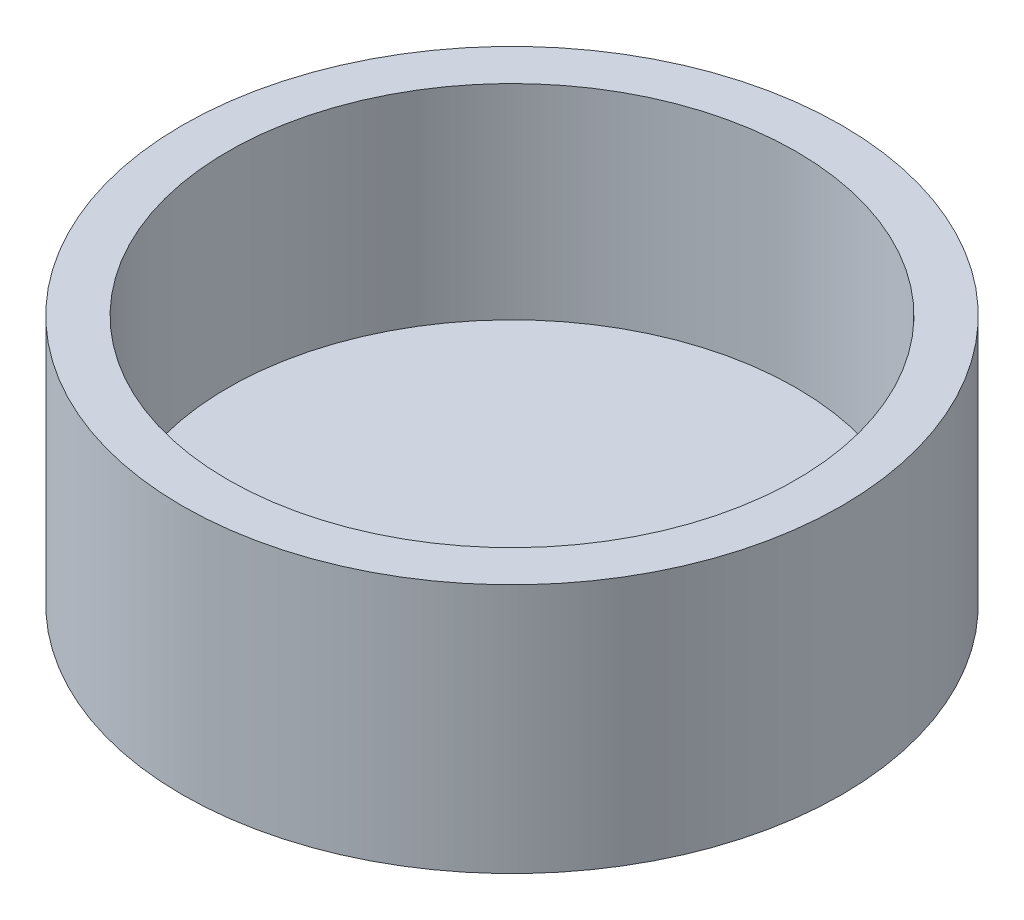
ISO-10303-21;
HEADER;
FILE_DESCRIPTION(('STEP AP214'),'2;1');
FILE_NAME('part.step','',(''),(''),'','','');
FILE_SCHEMA(('AUTOMOTIVE_DESIGN { 1 0 10303 214 1 1 1 1 }'));
ENDSEC;
DATA;
#1=APPLICATION_CONTEXT('core data for automotive mechanical design processes');
#2=APPLICATION_PROTOCOL_DEFINITION('international standard','automotive_design',2000,#1);
#3=PRODUCT_CONTEXT('',#1,'mechanical');
#4=PRODUCT('Part','Part','',(#3));
#5=PRODUCT_RELATED_PRODUCT_CATEGORY('part','',(#4));
#6=PRODUCT_DEFINITION_FORMATION('','',#4);
#7=PRODUCT_DEFINITION_CONTEXT('part definition',#1,'design');
#8=PRODUCT_DEFINITION('design','',#6,#7);
#9=PRODUCT_DEFINITION_SHAPE('','',#8);
#10=(LENGTH_UNIT() NAMED_UNIT(*) SI_UNIT(.MILLI.,.METRE.));
#11=(NAMED_UNIT(*) PLANE_ANGLE_UNIT() SI_UNIT($,.RADIAN.));
#12=(NAMED_UNIT(*) SI_UNIT($,.STERADIAN.) SOLID_ANGLE_UNIT());
#13=UNCERTAINTY_MEASURE_WITH_UNIT(LENGTH_MEASURE(1.E-05),#10,'distance_accuracy_value','');
#14=(GEOMETRIC_REPRESENTATION_CONTEXT(3) GLOBAL_UNCERTAINTY_ASSIGNED_CONTEXT((#13)) GLOBAL_UNIT_ASSIGNED_CONTEXT((#10,
#11,#12)) REPRESENTATION_CONTEXT('',''));
#15=CARTESIAN_POINT('',(0.,0.,0.));
#16=DIRECTION('',(0.,0.,1.));
#17=DIRECTION('',(1.,0.,0.));
#18=AXIS2_PLACEMENT_3D('',#15,#16,#17);
#19=CARTESIAN_POINT('',(0.,22.86,0.));
#20=DIRECTION('',(0.,-1.,0.));
#21=DIRECTION('',(0.,0.,-1.));
#22=AXIS2_PLACEMENT_3D('',#19,#20,#21);
#23=CYLINDRICAL_SURFACE('',#22,36.83);
#24=CARTESIAN_POINT('',(0.,22.86,0.));
#25=DIRECTION('',(0.,1.,0.));
#26=DIRECTION('',(0.,0.,1.));
#27=AXIS2_PLACEMENT_3D('',#24,#25,#26);
#28=CIRCLE('',#27,36.83);
#29=CARTESIAN_POINT('',(0.,22.86,36.83));
#30=VERTEX_POINT('',#29);
#31=EDGE_CURVE('E10',#30,#30,#28,.T.);
#32=ORIENTED_EDGE('',*,*,#31,.F.);
#33=EDGE_LOOP('',(#32));
#34=FACE_BOUND('',#33,.T.);
#35=CARTESIAN_POINT('',(0.,-5.08,0.));
#36=DIRECTION('',(0.,1.,0.));
#37=DIRECTION('',(0.,0.,1.));
#38=AXIS2_PLACEMENT_3D('',#35,#36,#37);
#39=CIRCLE('',#38,36.83);
#40=CARTESIAN_POINT('',(0.,-5.08,36.83));
#41=VERTEX_POINT('',#40);
#42=EDGE_CURVE('E45',#41,#41,#39,.T.);
#43=ORIENTED_EDGE('',*,*,#42,.T.);
#44=EDGE_LOOP('',(#43));
#45=FACE_BOUND('',#44,.T.);
#46=ADVANCED_FACE('F37',(#34,#45),#23,.T.);
#47=CARTESIAN_POINT('',(0.,22.86,0.));
#48=DIRECTION('',(0.,1.,0.));
#49=DIRECTION('',(0.,0.,1.));
#50=AXIS2_PLACEMENT_3D('',#47,#48,#49);
#51=PLANE('',#50);
#52=CARTESIAN_POINT('',(0.,22.86,0.));
#53=DIRECTION('',(0.,1.,0.));
#54=DIRECTION('',(0.,0.,1.));
#55=AXIS2_PLACEMENT_3D('',#52,#53,#54);
#56=CIRCLE('',#55,31.75);
#57=CARTESIAN_POINT('',(0.,22.86,31.75));
#58=VERTEX_POINT('',#57);
#59=EDGE_CURVE('E50',#58,#58,#56,.T.);
#60=ORIENTED_EDGE('',*,*,#59,.F.);
#61=EDGE_LOOP('',(#60));
#62=FACE_BOUND('',#61,.T.);
#63=ORIENTED_EDGE('',*,*,#31,.T.);
#64=EDGE_LOOP('',(#63));
#65=FACE_BOUND('',#64,.T.);
#66=ADVANCED_FACE('F73',(#62,#65),#51,.T.);
#67=CARTESIAN_POINT('',(0.,-5.08,0.));
#68=DIRECTION('',(0.,1.,0.));
#69=DIRECTION('',(0.,0.,1.));
#70=AXIS2_PLACEMENT_3D('',#67,#68,#69);
#71=PLANE('',#70);
#72=ORIENTED_EDGE('',*,*,#42,.F.);
#73=EDGE_LOOP('',(#72));
#74=FACE_BOUND('',#73,.T.);
#75=ADVANCED_FACE('F39',(#74),#71,.F.);
#76=CARTESIAN_POINT('',(0.,22.86,0.));
#77=DIRECTION('',(0.,-1.,0.));
#78=DIRECTION('',(0.,0.,-1.));
#79=AXIS2_PLACEMENT_3D('',#76,#77,#78);
#80=CYLINDRICAL_SURFACE('',#79,31.75);
#81=ORIENTED_EDGE('',*,*,#59,.T.);
#82=EDGE_LOOP('',(#81));
#83=FACE_BOUND('',#82,.T.);
#84=CARTESIAN_POINT('',(0.,0.,0.));
#85=DIRECTION('',(0.,1.,0.));
#86=DIRECTION('',(0.,0.,1.));
#87=AXIS2_PLACEMENT_3D('',#84,#85,#86);
#88=CIRCLE('',#87,31.75);
#89=CARTESIAN_POINT('',(0.,0.,31.75));
#90=VERTEX_POINT('',#89);
#91=EDGE_CURVE('E55',#90,#90,#88,.T.);
#92=ORIENTED_EDGE('',*,*,#91,.F.);
#93=EDGE_LOOP('',(#92));
#94=FACE_BOUND('',#93,.T.);
#95=ADVANCED_FACE('F64',(#83,#94),#80,.F.);
#96=CARTESIAN_POINT('',(0.,0.,0.));
#97=DIRECTION('',(0.,1.,0.));
#98=DIRECTION('',(0.,0.,1.));
#99=AXIS2_PLACEMENT_3D('',#96,#97,#98);
#100=PLANE('',#99);
#101=ORIENTED_EDGE('',*,*,#91,.T.);
#102=EDGE_LOOP('',(#101));
#103=FACE_BOUND('',#102,.T.);
#104=ADVANCED_FACE('F62',(#103),#100,.T.);
#105=CLOSED_SHELL('',(#46,#66,#75,#95,#104));
#106=MANIFOLD_SOLID_BREP('B2',#105);
#107=ADVANCED_BREP_SHAPE_REPRESENTATION('',(#18,#106),#14);
#108=SHAPE_DEFINITION_REPRESENTATION(#9,#107);
ENDSEC;
END-ISO-10303-21;
